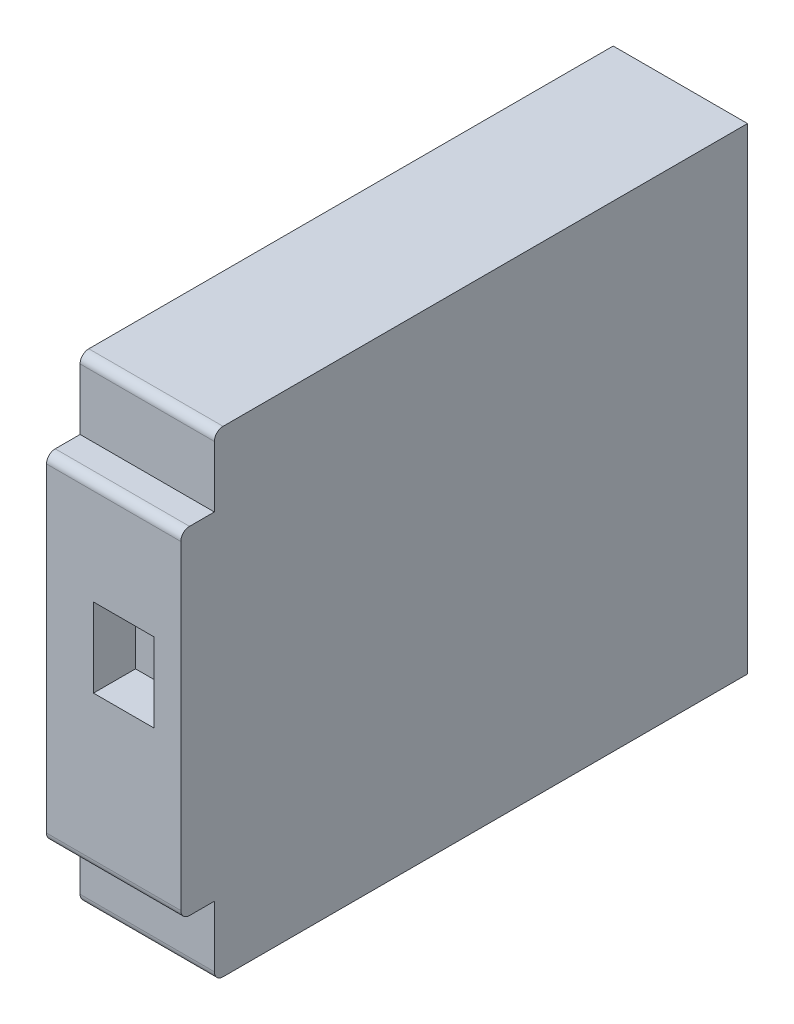
ISO-10303-21;
HEADER;
FILE_DESCRIPTION(('STEP AP214'),'2;1');
FILE_NAME('part.step','',(''),(''),'','','');
FILE_SCHEMA(('AUTOMOTIVE_DESIGN { 1 0 10303 214 1 1 1 1 }'));
ENDSEC;
DATA;
#1=APPLICATION_CONTEXT('core data for automotive mechanical design processes');
#2=APPLICATION_PROTOCOL_DEFINITION('international standard','automotive_design',2000,#1);
#3=PRODUCT_CONTEXT('',#1,'mechanical');
#4=PRODUCT('Part','Part','',(#3));
#5=PRODUCT_RELATED_PRODUCT_CATEGORY('part','',(#4));
#6=PRODUCT_DEFINITION_FORMATION('','',#4);
#7=PRODUCT_DEFINITION_CONTEXT('part definition',#1,'design');
#8=PRODUCT_DEFINITION('design','',#6,#7);
#9=PRODUCT_DEFINITION_SHAPE('','',#8);
#10=(LENGTH_UNIT() NAMED_UNIT(*) SI_UNIT(.MILLI.,.METRE.));
#11=(NAMED_UNIT(*) PLANE_ANGLE_UNIT() SI_UNIT($,.RADIAN.));
#12=(NAMED_UNIT(*) SI_UNIT($,.STERADIAN.) SOLID_ANGLE_UNIT());
#13=UNCERTAINTY_MEASURE_WITH_UNIT(LENGTH_MEASURE(1.E-05),#10,'distance_accuracy_value','');
#14=(GEOMETRIC_REPRESENTATION_CONTEXT(3) GLOBAL_UNCERTAINTY_ASSIGNED_CONTEXT((#13)) GLOBAL_UNIT_ASSIGNED_CONTEXT((#10,
#11,#12)) REPRESENTATION_CONTEXT('',''));
#15=CARTESIAN_POINT('',(0.,0.,0.));
#16=DIRECTION('',(0.,0.,1.));
#17=DIRECTION('',(1.,0.,0.));
#18=AXIS2_PLACEMENT_3D('',#15,#16,#17);
#19=CARTESIAN_POINT('',(0.,0.,99.2378));
#20=DIRECTION('',(0.,0.,1.));
#21=DIRECTION('',(1.,0.,0.));
#22=AXIS2_PLACEMENT_3D('',#19,#20,#21);
#23=PLANE('',#22);
#24=DIRECTION('',(1.,0.,0.));
#25=VECTOR('',#24,1.);
#26=CARTESIAN_POINT('',(20.32,57.15,99.2378));
#27=LINE('',#26,#25);
#28=CARTESIAN_POINT('',(20.32,57.15,99.2378));
#29=VERTEX_POINT('',#28);
#30=CARTESIAN_POINT('',(8.89,57.15,99.2378));
#31=VERTEX_POINT('',#30);
#32=EDGE_CURVE('E140',#29,#31,#27,.F.);
#33=ORIENTED_EDGE('',*,*,#32,.T.);
#34=DIRECTION('',(0.,1.,0.));
#35=VECTOR('',#34,1.);
#36=CARTESIAN_POINT('',(8.89,57.15,99.2378));
#37=LINE('',#36,#35);
#38=CARTESIAN_POINT('',(8.89,42.2148,99.2378));
#39=VERTEX_POINT('',#38);
#40=EDGE_CURVE('E251',#31,#39,#37,.F.);
#41=ORIENTED_EDGE('',*,*,#40,.T.);
#42=DIRECTION('',(1.,0.,0.));
#43=VECTOR('',#42,1.);
#44=CARTESIAN_POINT('',(8.89,42.2148,99.2378));
#45=LINE('',#44,#43);
#46=CARTESIAN_POINT('',(20.32,42.2148,99.2378));
#47=VERTEX_POINT('',#46);
#48=EDGE_CURVE('E136',#39,#47,#45,.T.);
#49=ORIENTED_EDGE('',*,*,#48,.T.);
#50=DIRECTION('',(0.,1.,0.));
#51=VECTOR('',#50,1.);
#52=CARTESIAN_POINT('',(20.32,42.2148,99.2378));
#53=LINE('',#52,#51);
#54=EDGE_CURVE('E138',#47,#29,#53,.T.);
#55=ORIENTED_EDGE('',*,*,#54,.T.);
#56=EDGE_LOOP('',(#33,#41,#49,#55));
#57=FACE_BOUND('',#56,.T.);
#58=ADVANCED_FACE('F17',(#57),#23,.T.);
#59=CARTESIAN_POINT('',(20.32,57.15,107.188));
#60=DIRECTION('',(0.,1.,0.));
#61=DIRECTION('',(0.,0.,1.));
#62=AXIS2_PLACEMENT_3D('',#59,#60,#61);
#63=PLANE('',#62);
#64=ORIENTED_EDGE('',*,*,#32,.F.);
#65=DIRECTION('',(0.,0.,-1.));
#66=VECTOR('',#65,1.);
#67=CARTESIAN_POINT('',(20.32,57.15,107.188));
#68=LINE('',#67,#66);
#69=CARTESIAN_POINT('',(20.32,57.15,107.188));
#70=VERTEX_POINT('',#69);
#71=EDGE_CURVE('E145',#29,#70,#68,.F.);
#72=ORIENTED_EDGE('',*,*,#71,.T.);
#73=DIRECTION('',(1.,0.,0.));
#74=VECTOR('',#73,1.);
#75=CARTESIAN_POINT('',(0.,57.15,107.188));
#76=LINE('',#75,#74);
#77=CARTESIAN_POINT('',(8.89,57.15,107.188));
#78=VERTEX_POINT('',#77);
#79=EDGE_CURVE('E218',#78,#70,#76,.T.);
#80=ORIENTED_EDGE('',*,*,#79,.F.);
#81=DIRECTION('',(0.,0.,1.));
#82=VECTOR('',#81,1.);
#83=CARTESIAN_POINT('',(8.89,57.15,107.188));
#84=LINE('',#83,#82);
#85=EDGE_CURVE('E151',#78,#31,#84,.F.);
#86=ORIENTED_EDGE('',*,*,#85,.T.);
#87=EDGE_LOOP('',(#64,#72,#80,#86));
#88=FACE_BOUND('',#87,.T.);
#89=ADVANCED_FACE('F148',(#88),#63,.F.);
#90=CARTESIAN_POINT('',(20.32,42.2148,107.188));
#91=DIRECTION('',(1.,0.,0.));
#92=DIRECTION('',(0.,0.,-1.));
#93=AXIS2_PLACEMENT_3D('',#90,#91,#92);
#94=PLANE('',#93);
#95=ORIENTED_EDGE('',*,*,#54,.F.);
#96=DIRECTION('',(0.,0.,-1.));
#97=VECTOR('',#96,1.);
#98=CARTESIAN_POINT('',(20.32,42.2148,107.188));
#99=LINE('',#98,#97);
#100=CARTESIAN_POINT('',(20.32,42.2148,107.188));
#101=VERTEX_POINT('',#100);
#102=EDGE_CURVE('E159',#47,#101,#99,.F.);
#103=ORIENTED_EDGE('',*,*,#102,.T.);
#104=DIRECTION('',(0.,1.,0.));
#105=VECTOR('',#104,1.);
#106=CARTESIAN_POINT('',(20.32,0.,107.188));
#107=LINE('',#106,#105);
#108=EDGE_CURVE('E156',#70,#101,#107,.F.);
#109=ORIENTED_EDGE('',*,*,#108,.F.);
#110=ORIENTED_EDGE('',*,*,#71,.F.);
#111=EDGE_LOOP('',(#95,#103,#109,#110));
#112=FACE_BOUND('',#111,.T.);
#113=ADVANCED_FACE('F154',(#112),#94,.F.);
#114=CARTESIAN_POINT('',(8.89,42.2148,107.188));
#115=DIRECTION('',(0.,-1.,0.));
#116=DIRECTION('',(0.,0.,-1.));
#117=AXIS2_PLACEMENT_3D('',#114,#115,#116);
#118=PLANE('',#117);
#119=ORIENTED_EDGE('',*,*,#48,.F.);
#120=DIRECTION('',(0.,0.,1.));
#121=VECTOR('',#120,1.);
#122=CARTESIAN_POINT('',(8.89,42.2148,107.188));
#123=LINE('',#122,#121);
#124=CARTESIAN_POINT('',(8.89,42.2148,107.188));
#125=VERTEX_POINT('',#124);
#126=EDGE_CURVE('E102',#39,#125,#123,.T.);
#127=ORIENTED_EDGE('',*,*,#126,.T.);
#128=DIRECTION('',(1.,0.,0.));
#129=VECTOR('',#128,1.);
#130=CARTESIAN_POINT('',(0.,42.2148,107.188));
#131=LINE('',#130,#129);
#132=EDGE_CURVE('E214',#101,#125,#131,.F.);
#133=ORIENTED_EDGE('',*,*,#132,.F.);
#134=ORIENTED_EDGE('',*,*,#102,.F.);
#135=EDGE_LOOP('',(#119,#127,#133,#134));
#136=FACE_BOUND('',#135,.T.);
#137=ADVANCED_FACE('F253',(#136),#118,.F.);
#138=CARTESIAN_POINT('',(8.89,57.15,107.188));
#139=DIRECTION('',(-1.,0.,0.));
#140=DIRECTION('',(0.,0.,1.));
#141=AXIS2_PLACEMENT_3D('',#138,#139,#140);
#142=PLANE('',#141);
#143=ORIENTED_EDGE('',*,*,#40,.F.);
#144=ORIENTED_EDGE('',*,*,#85,.F.);
#145=DIRECTION('',(0.,1.,0.));
#146=VECTOR('',#145,1.);
#147=CARTESIAN_POINT('',(8.89,0.,107.188));
#148=LINE('',#147,#146);
#149=EDGE_CURVE('E211',#125,#78,#148,.T.);
#150=ORIENTED_EDGE('',*,*,#149,.F.);
#151=ORIENTED_EDGE('',*,*,#126,.F.);
#152=EDGE_LOOP('',(#143,#144,#150,#151));
#153=FACE_BOUND('',#152,.T.);
#154=ADVANCED_FACE('F257',(#153),#142,.F.);
#155=CARTESIAN_POINT('',(0.,90.17,0.));
#156=DIRECTION('',(-1.,0.,0.));
#157=DIRECTION('',(0.,0.,1.));
#158=AXIS2_PLACEMENT_3D('',#155,#156,#157);
#159=PLANE('',#158);
#160=DIRECTION('',(0.,1.,0.));
#161=VECTOR('',#160,1.);
#162=CARTESIAN_POINT('',(0.,0.,107.188));
#163=LINE('',#162,#161);
#164=CARTESIAN_POINT('',(0.,75.311,107.188));
#165=VERTEX_POINT('',#164);
#166=CARTESIAN_POINT('',(0.,14.859,107.188));
#167=VERTEX_POINT('',#166);
#168=EDGE_CURVE('E92',#165,#167,#163,.F.);
#169=ORIENTED_EDGE('',*,*,#168,.F.);
#170=CARTESIAN_POINT('',(0.,75.311,105.537));
#171=DIRECTION('',(-1.,0.,0.));
#172=DIRECTION('',(0.,0.,1.));
#173=AXIS2_PLACEMENT_3D('',#170,#171,#172);
#174=CIRCLE('',#173,1.651);
#175=CARTESIAN_POINT('',(0.,76.962,105.537));
#176=VERTEX_POINT('',#175);
#177=EDGE_CURVE('E178',#176,#165,#174,.F.);
#178=ORIENTED_EDGE('',*,*,#177,.F.);
#179=DIRECTION('',(0.,0.,-1.));
#180=VECTOR('',#179,1.);
#181=CARTESIAN_POINT('',(0.,76.962,107.188));
#182=LINE('',#181,#180);
#183=CARTESIAN_POINT('',(0.,76.962,100.838));
#184=VERTEX_POINT('',#183);
#185=EDGE_CURVE('E220',#176,#184,#182,.T.);
#186=ORIENTED_EDGE('',*,*,#185,.T.);
#187=DIRECTION('',(0.,1.,0.));
#188=VECTOR('',#187,1.);
#189=CARTESIAN_POINT('',(0.,76.962,100.838));
#190=LINE('',#189,#188);
#191=CARTESIAN_POINT('',(0.,88.519,100.838));
#192=VERTEX_POINT('',#191);
#193=EDGE_CURVE('E223',#184,#192,#190,.T.);
#194=ORIENTED_EDGE('',*,*,#193,.T.);
#195=CARTESIAN_POINT('',(0.,88.519,99.187));
#196=DIRECTION('',(1.,0.,0.));
#197=DIRECTION('',(0.,0.,-1.));
#198=AXIS2_PLACEMENT_3D('',#195,#196,#197);
#199=CIRCLE('',#198,1.651);
#200=CARTESIAN_POINT('',(0.,90.17,99.187));
#201=VERTEX_POINT('',#200);
#202=EDGE_CURVE('E181',#201,#192,#199,.T.);
#203=ORIENTED_EDGE('',*,*,#202,.F.);
#204=DIRECTION('',(0.,0.,1.));
#205=VECTOR('',#204,1.);
#206=CARTESIAN_POINT('',(0.,90.17,0.));
#207=LINE('',#206,#205);
#208=CARTESIAN_POINT('',(0.,90.17,0.));
#209=VERTEX_POINT('',#208);
#210=EDGE_CURVE('E231',#209,#201,#207,.T.);
#211=ORIENTED_EDGE('',*,*,#210,.F.);
#212=DIRECTION('',(0.,1.,0.));
#213=VECTOR('',#212,1.);
#214=CARTESIAN_POINT('',(0.,0.,0.));
#215=LINE('',#214,#213);
#216=CARTESIAN_POINT('',(0.,0.,0.));
#217=VERTEX_POINT('',#216);
#218=EDGE_CURVE('E236',#209,#217,#215,.F.);
#219=ORIENTED_EDGE('',*,*,#218,.T.);
#220=DIRECTION('',(0.,0.,-1.));
#221=VECTOR('',#220,1.);
#222=CARTESIAN_POINT('',(0.,0.,0.));
#223=LINE('',#222,#221);
#224=CARTESIAN_POINT('',(0.,0.,99.187));
#225=VERTEX_POINT('',#224);
#226=EDGE_CURVE('E186',#225,#217,#223,.T.);
#227=ORIENTED_EDGE('',*,*,#226,.F.);
#228=CARTESIAN_POINT('',(0.,1.651,99.187));
#229=DIRECTION('',(-1.,0.,0.));
#230=DIRECTION('',(0.,0.,1.));
#231=AXIS2_PLACEMENT_3D('',#228,#229,#230);
#232=CIRCLE('',#231,1.651);
#233=CARTESIAN_POINT('',(0.,1.651,100.838));
#234=VERTEX_POINT('',#233);
#235=EDGE_CURVE('E184',#234,#225,#232,.F.);
#236=ORIENTED_EDGE('',*,*,#235,.F.);
#237=DIRECTION('',(0.,1.,0.));
#238=VECTOR('',#237,1.);
#239=CARTESIAN_POINT('',(0.,0.,100.838));
#240=LINE('',#239,#238);
#241=CARTESIAN_POINT('',(0.,13.208,100.838));
#242=VERTEX_POINT('',#241);
#243=EDGE_CURVE('E198',#234,#242,#240,.T.);
#244=ORIENTED_EDGE('',*,*,#243,.T.);
#245=DIRECTION('',(0.,0.,1.));
#246=VECTOR('',#245,1.);
#247=CARTESIAN_POINT('',(0.,13.208,100.838));
#248=LINE('',#247,#246);
#249=CARTESIAN_POINT('',(0.,13.208,105.537));
#250=VERTEX_POINT('',#249);
#251=EDGE_CURVE('E207',#242,#250,#248,.T.);
#252=ORIENTED_EDGE('',*,*,#251,.T.);
#253=CARTESIAN_POINT('',(0.,14.859,105.537));
#254=DIRECTION('',(1.,0.,0.));
#255=DIRECTION('',(0.,0.,-1.));
#256=AXIS2_PLACEMENT_3D('',#253,#254,#255);
#257=CIRCLE('',#256,1.651);
#258=EDGE_CURVE('E20',#167,#250,#257,.T.);
#259=ORIENTED_EDGE('',*,*,#258,.F.);
#260=EDGE_LOOP('',(#169,#178,#186,#194,#203,#211,#219,#227,#236,#244,#252,#259));
#261=FACE_BOUND('',#260,.T.);
#262=ADVANCED_FACE('F259',(#261),#159,.T.);
#263=CARTESIAN_POINT('',(0.,0.,107.188));
#264=DIRECTION('',(0.,0.,1.));
#265=DIRECTION('',(1.,0.,0.));
#266=AXIS2_PLACEMENT_3D('',#263,#264,#265);
#267=PLANE('',#266);
#268=ORIENTED_EDGE('',*,*,#132,.T.);
#269=ORIENTED_EDGE('',*,*,#149,.T.);
#270=ORIENTED_EDGE('',*,*,#79,.T.);
#271=ORIENTED_EDGE('',*,*,#108,.T.);
#272=EDGE_LOOP('',(#268,#269,#270,#271));
#273=FACE_BOUND('',#272,.T.);
#274=DIRECTION('',(0.,1.,0.));
#275=VECTOR('',#274,1.);
#276=CARTESIAN_POINT('',(25.4,0.,107.188));
#277=LINE('',#276,#275);
#278=CARTESIAN_POINT('',(25.4,75.311,107.188));
#279=VERTEX_POINT('',#278);
#280=CARTESIAN_POINT('',(25.4,14.859,107.188));
#281=VERTEX_POINT('',#280);
#282=EDGE_CURVE('E177',#279,#281,#277,.F.);
#283=ORIENTED_EDGE('',*,*,#282,.F.);
#284=DIRECTION('',(-1.,0.,0.));
#285=VECTOR('',#284,1.);
#286=CARTESIAN_POINT('',(58.51144,75.311,107.188));
#287=LINE('',#286,#285);
#288=EDGE_CURVE('E478',#165,#279,#287,.F.);
#289=ORIENTED_EDGE('',*,*,#288,.F.);
#290=ORIENTED_EDGE('',*,*,#168,.T.);
#291=DIRECTION('',(1.,0.,0.));
#292=VECTOR('',#291,1.);
#293=CARTESIAN_POINT('',(-33.11144,14.859,107.188));
#294=LINE('',#293,#292);
#295=EDGE_CURVE('E208',#281,#167,#294,.F.);
#296=ORIENTED_EDGE('',*,*,#295,.F.);
#297=EDGE_LOOP('',(#283,#289,#290,#296));
#298=FACE_BOUND('',#297,.T.);
#299=ADVANCED_FACE('F255',(#273,#298),#267,.T.);
#300=CARTESIAN_POINT('',(-33.11144,14.859,105.537));
#301=DIRECTION('',(1.,0.,0.));
#302=DIRECTION('',(0.,0.,-1.));
#303=AXIS2_PLACEMENT_3D('',#300,#301,#302);
#304=CYLINDRICAL_SURFACE('',#303,1.651);
#305=DIRECTION('',(1.,0.,0.));
#306=VECTOR('',#305,1.);
#307=CARTESIAN_POINT('',(25.4,13.208,105.537));
#308=LINE('',#307,#306);
#309=CARTESIAN_POINT('',(25.4,13.208,105.537));
#310=VERTEX_POINT('',#309);
#311=EDGE_CURVE('E205',#250,#310,#308,.T.);
#312=ORIENTED_EDGE('',*,*,#311,.T.);
#313=CARTESIAN_POINT('',(25.4,14.859,105.537));
#314=DIRECTION('',(1.,0.,0.));
#315=DIRECTION('',(0.,0.,-1.));
#316=AXIS2_PLACEMENT_3D('',#313,#314,#315);
#317=CIRCLE('',#316,1.651);
#318=EDGE_CURVE('E173',#281,#310,#317,.T.);
#319=ORIENTED_EDGE('',*,*,#318,.F.);
#320=ORIENTED_EDGE('',*,*,#295,.T.);
#321=ORIENTED_EDGE('',*,*,#258,.T.);
#322=EDGE_LOOP('',(#312,#319,#320,#321));
#323=FACE_BOUND('',#322,.T.);
#324=ADVANCED_FACE('F314',(#323),#304,.T.);
#325=CARTESIAN_POINT('',(25.4,13.208,100.838));
#326=DIRECTION('',(0.,1.,0.));
#327=DIRECTION('',(0.,0.,1.));
#328=AXIS2_PLACEMENT_3D('',#325,#326,#327);
#329=PLANE('',#328);
#330=DIRECTION('',(-1.,0.,0.));
#331=VECTOR('',#330,1.);
#332=CARTESIAN_POINT('',(25.4,13.208,100.838));
#333=LINE('',#332,#331);
#334=CARTESIAN_POINT('',(25.4,13.208,100.838));
#335=VERTEX_POINT('',#334);
#336=EDGE_CURVE('E195',#242,#335,#333,.F.);
#337=ORIENTED_EDGE('',*,*,#336,.T.);
#338=DIRECTION('',(0.,0.,-1.));
#339=VECTOR('',#338,1.);
#340=CARTESIAN_POINT('',(25.4,13.208,0.));
#341=LINE('',#340,#339);
#342=EDGE_CURVE('E176',#310,#335,#341,.T.);
#343=ORIENTED_EDGE('',*,*,#342,.F.);
#344=ORIENTED_EDGE('',*,*,#311,.F.);
#345=ORIENTED_EDGE('',*,*,#251,.F.);
#346=EDGE_LOOP('',(#337,#343,#344,#345));
#347=FACE_BOUND('',#346,.T.);
#348=ADVANCED_FACE('F310',(#347),#329,.F.);
#349=CARTESIAN_POINT('',(25.4,0.,100.838));
#350=DIRECTION('',(0.,0.,-1.));
#351=DIRECTION('',(-1.,0.,0.));
#352=AXIS2_PLACEMENT_3D('',#349,#350,#351);
#353=PLANE('',#352);
#354=ORIENTED_EDGE('',*,*,#336,.F.);
#355=ORIENTED_EDGE('',*,*,#243,.F.);
#356=DIRECTION('',(-1.,0.,0.));
#357=VECTOR('',#356,1.);
#358=CARTESIAN_POINT('',(58.51144,1.651,100.838));
#359=LINE('',#358,#357);
#360=CARTESIAN_POINT('',(25.4,1.651,100.838));
#361=VERTEX_POINT('',#360);
#362=EDGE_CURVE('E187',#361,#234,#359,.T.);
#363=ORIENTED_EDGE('',*,*,#362,.F.);
#364=DIRECTION('',(0.,1.,0.));
#365=VECTOR('',#364,1.);
#366=CARTESIAN_POINT('',(25.4,0.,100.838));
#367=LINE('',#366,#365);
#368=EDGE_CURVE('E172',#335,#361,#367,.F.);
#369=ORIENTED_EDGE('',*,*,#368,.F.);
#370=EDGE_LOOP('',(#354,#355,#363,#369));
#371=FACE_BOUND('',#370,.T.);
#372=ADVANCED_FACE('F307',(#371),#353,.F.);
#373=CARTESIAN_POINT('',(58.51144,1.651,99.187));
#374=DIRECTION('',(-1.,0.,0.));
#375=DIRECTION('',(0.,0.,1.));
#376=AXIS2_PLACEMENT_3D('',#373,#374,#375);
#377=CYLINDRICAL_SURFACE('',#376,1.651);
#378=ORIENTED_EDGE('',*,*,#362,.T.);
#379=ORIENTED_EDGE('',*,*,#235,.T.);
#380=DIRECTION('',(1.,0.,0.));
#381=VECTOR('',#380,1.);
#382=CARTESIAN_POINT('',(0.,0.,99.187));
#383=LINE('',#382,#381);
#384=CARTESIAN_POINT('',(25.4,0.,99.187));
#385=VERTEX_POINT('',#384);
#386=EDGE_CURVE('E193',#385,#225,#383,.F.);
#387=ORIENTED_EDGE('',*,*,#386,.F.);
#388=CARTESIAN_POINT('',(25.4,1.651,99.187));
#389=DIRECTION('',(-1.,0.,0.));
#390=DIRECTION('',(0.,0.,1.));
#391=AXIS2_PLACEMENT_3D('',#388,#389,#390);
#392=CIRCLE('',#391,1.651);
#393=EDGE_CURVE('E168',#361,#385,#392,.F.);
#394=ORIENTED_EDGE('',*,*,#393,.F.);
#395=EDGE_LOOP('',(#378,#379,#387,#394));
#396=FACE_BOUND('',#395,.T.);
#397=ADVANCED_FACE('F303',(#396),#377,.T.);
#398=CARTESIAN_POINT('',(0.,0.,0.));
#399=DIRECTION('',(0.,-1.,0.));
#400=DIRECTION('',(0.,0.,-1.));
#401=AXIS2_PLACEMENT_3D('',#398,#399,#400);
#402=PLANE('',#401);
#403=DIRECTION('',(0.,0.,-1.));
#404=VECTOR('',#403,1.);
#405=CARTESIAN_POINT('',(25.4,0.,0.));
#406=LINE('',#405,#404);
#407=CARTESIAN_POINT('',(25.4,0.,0.));
#408=VERTEX_POINT('',#407);
#409=EDGE_CURVE('E171',#385,#408,#406,.T.);
#410=ORIENTED_EDGE('',*,*,#409,.F.);
#411=ORIENTED_EDGE('',*,*,#386,.T.);
#412=ORIENTED_EDGE('',*,*,#226,.T.);
#413=DIRECTION('',(1.,0.,0.));
#414=VECTOR('',#413,1.);
#415=CARTESIAN_POINT('',(0.,0.,0.));
#416=LINE('',#415,#414);
#417=EDGE_CURVE('E238',#217,#408,#416,.T.);
#418=ORIENTED_EDGE('',*,*,#417,.T.);
#419=EDGE_LOOP('',(#410,#411,#412,#418));
#420=FACE_BOUND('',#419,.T.);
#421=ADVANCED_FACE('F299',(#420),#402,.T.);
#422=CARTESIAN_POINT('',(0.,0.,0.));
#423=DIRECTION('',(0.,0.,1.));
#424=DIRECTION('',(1.,0.,0.));
#425=AXIS2_PLACEMENT_3D('',#422,#423,#424);
#426=PLANE('',#425);
#427=DIRECTION('',(0.,1.,0.));
#428=VECTOR('',#427,1.);
#429=CARTESIAN_POINT('',(25.4,0.,0.));
#430=LINE('',#429,#428);
#431=CARTESIAN_POINT('',(25.4,90.17,0.));
#432=VERTEX_POINT('',#431);
#433=EDGE_CURVE('E491',#408,#432,#430,.T.);
#434=ORIENTED_EDGE('',*,*,#433,.F.);
#435=ORIENTED_EDGE('',*,*,#417,.F.);
#436=ORIENTED_EDGE('',*,*,#218,.F.);
#437=DIRECTION('',(1.,0.,0.));
#438=VECTOR('',#437,1.);
#439=CARTESIAN_POINT('',(25.4,90.17,0.));
#440=LINE('',#439,#438);
#441=EDGE_CURVE('E233',#432,#209,#440,.F.);
#442=ORIENTED_EDGE('',*,*,#441,.F.);
#443=EDGE_LOOP('',(#434,#435,#436,#442));
#444=FACE_BOUND('',#443,.T.);
#445=ADVANCED_FACE('F295',(#444),#426,.F.);
#446=CARTESIAN_POINT('',(25.4,90.17,0.));
#447=DIRECTION('',(0.,1.,0.));
#448=DIRECTION('',(0.,0.,1.));
#449=AXIS2_PLACEMENT_3D('',#446,#447,#448);
#450=PLANE('',#449);
#451=ORIENTED_EDGE('',*,*,#210,.T.);
#452=DIRECTION('',(1.,0.,0.));
#453=VECTOR('',#452,1.);
#454=CARTESIAN_POINT('',(-33.11144,90.17,99.187));
#455=LINE('',#454,#453);
#456=CARTESIAN_POINT('',(25.4,90.17,99.187));
#457=VERTEX_POINT('',#456);
#458=EDGE_CURVE('E183',#457,#201,#455,.F.);
#459=ORIENTED_EDGE('',*,*,#458,.F.);
#460=DIRECTION('',(0.,0.,-1.));
#461=VECTOR('',#460,1.);
#462=CARTESIAN_POINT('',(25.4,90.17,0.));
#463=LINE('',#462,#461);
#464=EDGE_CURVE('E167',#432,#457,#463,.F.);
#465=ORIENTED_EDGE('',*,*,#464,.F.);
#466=ORIENTED_EDGE('',*,*,#441,.T.);
#467=EDGE_LOOP('',(#451,#459,#465,#466));
#468=FACE_BOUND('',#467,.T.);
#469=ADVANCED_FACE('F291',(#468),#450,.T.);
#470=CARTESIAN_POINT('',(-33.11144,88.519,99.187));
#471=DIRECTION('',(1.,0.,0.));
#472=DIRECTION('',(0.,0.,-1.));
#473=AXIS2_PLACEMENT_3D('',#470,#471,#472);
#474=CYLINDRICAL_SURFACE('',#473,1.651);
#475=DIRECTION('',(-1.,0.,0.));
#476=VECTOR('',#475,1.);
#477=CARTESIAN_POINT('',(25.4,88.519,100.838));
#478=LINE('',#477,#476);
#479=CARTESIAN_POINT('',(25.4,88.519,100.838));
#480=VERTEX_POINT('',#479);
#481=EDGE_CURVE('E182',#192,#480,#478,.F.);
#482=ORIENTED_EDGE('',*,*,#481,.T.);
#483=CARTESIAN_POINT('',(25.4,88.519,99.187));
#484=DIRECTION('',(1.,0.,0.));
#485=DIRECTION('',(0.,0.,-1.));
#486=AXIS2_PLACEMENT_3D('',#483,#484,#485);
#487=CIRCLE('',#486,1.651);
#488=EDGE_CURVE('E163',#457,#480,#487,.T.);
#489=ORIENTED_EDGE('',*,*,#488,.F.);
#490=ORIENTED_EDGE('',*,*,#458,.T.);
#491=ORIENTED_EDGE('',*,*,#202,.T.);
#492=EDGE_LOOP('',(#482,#489,#490,#491));
#493=FACE_BOUND('',#492,.T.);
#494=ADVANCED_FACE('F287',(#493),#474,.T.);
#495=CARTESIAN_POINT('',(25.4,76.962,100.838));
#496=DIRECTION('',(0.,0.,-1.));
#497=DIRECTION('',(-1.,0.,0.));
#498=AXIS2_PLACEMENT_3D('',#495,#496,#497);
#499=PLANE('',#498);
#500=DIRECTION('',(1.,0.,0.));
#501=VECTOR('',#500,1.);
#502=CARTESIAN_POINT('',(25.4,76.962,100.838));
#503=LINE('',#502,#501);
#504=CARTESIAN_POINT('',(25.4,76.962,100.838));
#505=VERTEX_POINT('',#504);
#506=EDGE_CURVE('E222',#184,#505,#503,.T.);
#507=ORIENTED_EDGE('',*,*,#506,.T.);
#508=DIRECTION('',(0.,1.,0.));
#509=VECTOR('',#508,1.);
#510=CARTESIAN_POINT('',(25.4,0.,100.838));
#511=LINE('',#510,#509);
#512=EDGE_CURVE('E166',#480,#505,#511,.F.);
#513=ORIENTED_EDGE('',*,*,#512,.F.);
#514=ORIENTED_EDGE('',*,*,#481,.F.);
#515=ORIENTED_EDGE('',*,*,#193,.F.);
#516=EDGE_LOOP('',(#507,#513,#514,#515));
#517=FACE_BOUND('',#516,.T.);
#518=ADVANCED_FACE('F284',(#517),#499,.F.);
#519=CARTESIAN_POINT('',(25.4,76.962,107.188));
#520=DIRECTION('',(0.,-1.,0.));
#521=DIRECTION('',(0.,0.,-1.));
#522=AXIS2_PLACEMENT_3D('',#519,#520,#521);
#523=PLANE('',#522);
#524=ORIENTED_EDGE('',*,*,#506,.F.);
#525=ORIENTED_EDGE('',*,*,#185,.F.);
#526=DIRECTION('',(-1.,0.,0.));
#527=VECTOR('',#526,1.);
#528=CARTESIAN_POINT('',(58.51144,76.962,105.537));
#529=LINE('',#528,#527);
#530=CARTESIAN_POINT('',(25.4,76.962,105.537));
#531=VERTEX_POINT('',#530);
#532=EDGE_CURVE('E35',#531,#176,#529,.T.);
#533=ORIENTED_EDGE('',*,*,#532,.F.);
#534=DIRECTION('',(0.,0.,-1.));
#535=VECTOR('',#534,1.);
#536=CARTESIAN_POINT('',(25.4,76.962,0.));
#537=LINE('',#536,#535);
#538=EDGE_CURVE('E26',#505,#531,#537,.F.);
#539=ORIENTED_EDGE('',*,*,#538,.F.);
#540=EDGE_LOOP('',(#524,#525,#533,#539));
#541=FACE_BOUND('',#540,.T.);
#542=ADVANCED_FACE('F277',(#541),#523,.F.);
#543=CARTESIAN_POINT('',(58.51144,75.311,105.537));
#544=DIRECTION('',(-1.,0.,0.));
#545=DIRECTION('',(0.,0.,1.));
#546=AXIS2_PLACEMENT_3D('',#543,#544,#545);
#547=CYLINDRICAL_SURFACE('',#546,1.651);
#548=ORIENTED_EDGE('',*,*,#532,.T.);
#549=ORIENTED_EDGE('',*,*,#177,.T.);
#550=ORIENTED_EDGE('',*,*,#288,.T.);
#551=CARTESIAN_POINT('',(25.4,75.311,105.537));
#552=DIRECTION('',(-1.,0.,0.));
#553=DIRECTION('',(0.,0.,1.));
#554=AXIS2_PLACEMENT_3D('',#551,#552,#553);
#555=CIRCLE('',#554,1.651);
#556=EDGE_CURVE('E11',#531,#279,#555,.F.);
#557=ORIENTED_EDGE('',*,*,#556,.F.);
#558=EDGE_LOOP('',(#548,#549,#550,#557));
#559=FACE_BOUND('',#558,.T.);
#560=ADVANCED_FACE('F271',(#559),#547,.T.);
#561=CARTESIAN_POINT('',(25.4,0.,0.));
#562=DIRECTION('',(1.,0.,0.));
#563=DIRECTION('',(0.,0.,-1.));
#564=AXIS2_PLACEMENT_3D('',#561,#562,#563);
#565=PLANE('',#564);
#566=ORIENTED_EDGE('',*,*,#538,.T.);
#567=ORIENTED_EDGE('',*,*,#556,.T.);
#568=ORIENTED_EDGE('',*,*,#282,.T.);
#569=ORIENTED_EDGE('',*,*,#318,.T.);
#570=ORIENTED_EDGE('',*,*,#342,.T.);
#571=ORIENTED_EDGE('',*,*,#368,.T.);
#572=ORIENTED_EDGE('',*,*,#393,.T.);
#573=ORIENTED_EDGE('',*,*,#409,.T.);
#574=ORIENTED_EDGE('',*,*,#433,.T.);
#575=ORIENTED_EDGE('',*,*,#464,.T.);
#576=ORIENTED_EDGE('',*,*,#488,.T.);
#577=ORIENTED_EDGE('',*,*,#512,.T.);
#578=EDGE_LOOP('',(#566,#567,#568,#569,#570,#571,#572,#573,#574,#575,#576,#577));
#579=FACE_BOUND('',#578,.T.);
#580=ADVANCED_FACE('F269',(#579),#565,.T.);
#581=CLOSED_SHELL('',(#58,#89,#113,#137,#154,#262,#299,#324,#348,#372,#397,#421,#445,#469,#494,
#518,#542,#560,#580));
#582=MANIFOLD_SOLID_BREP('B1',#581);
#583=ADVANCED_BREP_SHAPE_REPRESENTATION('',(#18,#582),#14);
#584=SHAPE_DEFINITION_REPRESENTATION(#9,#583);
ENDSEC;
END-ISO-10303-21;
